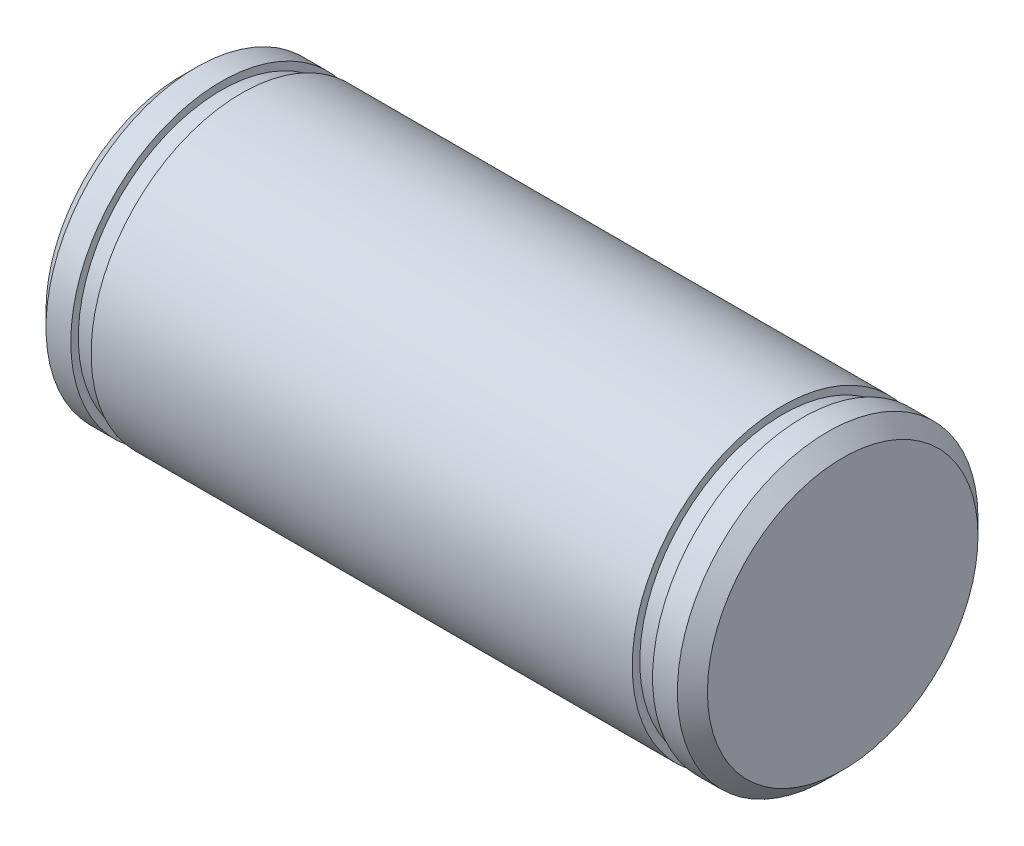
ISO-10303-21;
HEADER;
FILE_DESCRIPTION(('STEP AP214'),'2;1');
FILE_NAME('part.step','',(''),(''),'','','');
FILE_SCHEMA(('AUTOMOTIVE_DESIGN { 1 0 10303 214 1 1 1 1 }'));
ENDSEC;
DATA;
#1=APPLICATION_CONTEXT('core data for automotive mechanical design processes');
#2=APPLICATION_PROTOCOL_DEFINITION('international standard','automotive_design',2000,#1);
#3=PRODUCT_CONTEXT('',#1,'mechanical');
#4=PRODUCT('Part','Part','',(#3));
#5=PRODUCT_RELATED_PRODUCT_CATEGORY('part','',(#4));
#6=PRODUCT_DEFINITION_FORMATION('','',#4);
#7=PRODUCT_DEFINITION_CONTEXT('part definition',#1,'design');
#8=PRODUCT_DEFINITION('design','',#6,#7);
#9=PRODUCT_DEFINITION_SHAPE('','',#8);
#10=(LENGTH_UNIT() NAMED_UNIT(*) SI_UNIT(.MILLI.,.METRE.));
#11=(NAMED_UNIT(*) PLANE_ANGLE_UNIT() SI_UNIT($,.RADIAN.));
#12=(NAMED_UNIT(*) SI_UNIT($,.STERADIAN.) SOLID_ANGLE_UNIT());
#13=UNCERTAINTY_MEASURE_WITH_UNIT(LENGTH_MEASURE(1.E-05),#10,'distance_accuracy_value','');
#14=(GEOMETRIC_REPRESENTATION_CONTEXT(3) GLOBAL_UNCERTAINTY_ASSIGNED_CONTEXT((#13)) GLOBAL_UNIT_ASSIGNED_CONTEXT((#10,
#11,#12)) REPRESENTATION_CONTEXT('',''));
#15=CARTESIAN_POINT('',(0.,0.,0.));
#16=DIRECTION('',(0.,0.,1.));
#17=DIRECTION('',(1.,0.,0.));
#18=AXIS2_PLACEMENT_3D('',#15,#16,#17);
#19=CARTESIAN_POINT('',(22.,0.,0.));
#20=DIRECTION('',(1.,0.,0.));
#21=DIRECTION('',(0.,0.,-1.));
#22=AXIS2_PLACEMENT_3D('',#19,#20,#21);
#23=CYLINDRICAL_SURFACE('',#22,10.);
#24=CARTESIAN_POINT('',(19.35,0.,0.));
#25=DIRECTION('',(1.,0.,0.));
#26=DIRECTION('',(0.,0.,-1.));
#27=AXIS2_PLACEMENT_3D('',#24,#25,#26);
#28=CIRCLE('',#27,10.);
#29=CARTESIAN_POINT('',(19.35,0.,-10.));
#30=VERTEX_POINT('',#29);
#31=EDGE_CURVE('E113',#30,#30,#28,.T.);
#32=ORIENTED_EDGE('',*,*,#31,.T.);
#33=EDGE_LOOP('',(#32));
#34=FACE_BOUND('',#33,.T.);
#35=CARTESIAN_POINT('',(21.,0.,0.));
#36=DIRECTION('',(1.,0.,0.));
#37=DIRECTION('',(0.,0.,-1.));
#38=AXIS2_PLACEMENT_3D('',#35,#36,#37);
#39=CIRCLE('',#38,10.);
#40=CARTESIAN_POINT('',(21.,0.,-10.));
#41=VERTEX_POINT('',#40);
#42=EDGE_CURVE('E10',#41,#41,#39,.T.);
#43=ORIENTED_EDGE('',*,*,#42,.F.);
#44=EDGE_LOOP('',(#43));
#45=FACE_BOUND('',#44,.T.);
#46=ADVANCED_FACE('F15',(#34,#45),#23,.T.);
#47=CARTESIAN_POINT('',(21.,0.,0.));
#48=DIRECTION('',(-1.,0.,0.));
#49=DIRECTION('',(0.,0.,1.));
#50=AXIS2_PLACEMENT_3D('',#47,#48,#49);
#51=CONICAL_SURFACE('',#50,10.,0.785398163397446);
#52=ORIENTED_EDGE('',*,*,#42,.T.);
#53=EDGE_LOOP('',(#52));
#54=FACE_BOUND('',#53,.T.);
#55=CARTESIAN_POINT('',(22.,0.,0.));
#56=DIRECTION('',(1.,0.,0.));
#57=DIRECTION('',(0.,0.,-1.));
#58=AXIS2_PLACEMENT_3D('',#55,#56,#57);
#59=CIRCLE('',#58,9.);
#60=CARTESIAN_POINT('',(22.,0.,-9.));
#61=VERTEX_POINT('',#60);
#62=EDGE_CURVE('E24',#61,#61,#59,.T.);
#63=ORIENTED_EDGE('',*,*,#62,.F.);
#64=EDGE_LOOP('',(#63));
#65=FACE_BOUND('',#64,.T.);
#66=ADVANCED_FACE('F133',(#54,#65),#51,.T.);
#67=CARTESIAN_POINT('',(22.,9.,0.));
#68=DIRECTION('',(-1.,0.,0.));
#69=DIRECTION('',(0.,0.,1.));
#70=AXIS2_PLACEMENT_3D('',#67,#68,#69);
#71=PLANE('',#70);
#72=ORIENTED_EDGE('',*,*,#62,.T.);
#73=EDGE_LOOP('',(#72));
#74=FACE_BOUND('',#73,.T.);
#75=ADVANCED_FACE('F124',(#74),#71,.F.);
#76=CARTESIAN_POINT('',(72.,0.,0.));
#77=DIRECTION('',(1.,0.,0.));
#78=DIRECTION('',(0.,0.,-1.));
#79=AXIS2_PLACEMENT_3D('',#76,#77,#78);
#80=CYLINDRICAL_SURFACE('',#79,9.5);
#81=CARTESIAN_POINT('',(18.,0.,0.));
#82=DIRECTION('',(1.,0.,0.));
#83=DIRECTION('',(0.,0.,-1.));
#84=AXIS2_PLACEMENT_3D('',#81,#82,#83);
#85=CIRCLE('',#84,9.5);
#86=CARTESIAN_POINT('',(18.,0.,-9.5));
#87=VERTEX_POINT('',#86);
#88=EDGE_CURVE('E95',#87,#87,#85,.T.);
#89=ORIENTED_EDGE('',*,*,#88,.T.);
#90=EDGE_LOOP('',(#89));
#91=FACE_BOUND('',#90,.T.);
#92=CARTESIAN_POINT('',(19.35,0.,0.));
#93=DIRECTION('',(1.,0.,0.));
#94=DIRECTION('',(0.,0.,-1.));
#95=AXIS2_PLACEMENT_3D('',#92,#93,#94);
#96=CIRCLE('',#95,9.5);
#97=CARTESIAN_POINT('',(19.35,0.,-9.5));
#98=VERTEX_POINT('',#97);
#99=EDGE_CURVE('E112',#98,#98,#96,.T.);
#100=ORIENTED_EDGE('',*,*,#99,.F.);
#101=EDGE_LOOP('',(#100));
#102=FACE_BOUND('',#101,.T.);
#103=ADVANCED_FACE('F17',(#91,#102),#80,.T.);
#104=CARTESIAN_POINT('',(19.35,9.5,0.));
#105=DIRECTION('',(1.,0.,0.));
#106=DIRECTION('',(0.,1.,0.));
#107=AXIS2_PLACEMENT_3D('',#104,#105,#106);
#108=PLANE('',#107);
#109=ORIENTED_EDGE('',*,*,#99,.T.);
#110=EDGE_LOOP('',(#109));
#111=FACE_BOUND('',#110,.T.);
#112=ORIENTED_EDGE('',*,*,#31,.F.);
#113=EDGE_LOOP('',(#112));
#114=FACE_BOUND('',#113,.T.);
#115=ADVANCED_FACE('F120',(#111,#114),#108,.F.);
#116=CARTESIAN_POINT('',(18.,29.5,0.));
#117=DIRECTION('',(-1.,0.,0.));
#118=DIRECTION('',(0.,0.,1.));
#119=AXIS2_PLACEMENT_3D('',#116,#117,#118);
#120=PLANE('',#119);
#121=CARTESIAN_POINT('',(18.,0.,0.));
#122=DIRECTION('',(-1.,0.,0.));
#123=DIRECTION('',(0.,0.,1.));
#124=AXIS2_PLACEMENT_3D('',#121,#122,#123);
#125=CIRCLE('',#124,10.);
#126=CARTESIAN_POINT('',(18.,0.,10.));
#127=VERTEX_POINT('',#126);
#128=EDGE_CURVE('E81',#127,#127,#125,.T.);
#129=ORIENTED_EDGE('',*,*,#128,.F.);
#130=EDGE_LOOP('',(#129));
#131=FACE_BOUND('',#130,.T.);
#132=ORIENTED_EDGE('',*,*,#88,.F.);
#133=EDGE_LOOP('',(#132));
#134=FACE_BOUND('',#133,.T.);
#135=ADVANCED_FACE('F131',(#131,#134),#120,.F.);
#136=CARTESIAN_POINT('',(72.,0.,0.));
#137=DIRECTION('',(1.,0.,0.));
#138=DIRECTION('',(0.,0.,-1.));
#139=AXIS2_PLACEMENT_3D('',#136,#137,#138);
#140=CYLINDRICAL_SURFACE('',#139,9.5);
#141=CARTESIAN_POINT('',(-19.35,0.,0.));
#142=DIRECTION('',(1.,0.,0.));
#143=DIRECTION('',(0.,0.,-1.));
#144=AXIS2_PLACEMENT_3D('',#141,#142,#143);
#145=CIRCLE('',#144,9.5);
#146=CARTESIAN_POINT('',(-19.35,0.,-9.5));
#147=VERTEX_POINT('',#146);
#148=EDGE_CURVE('E98',#147,#147,#145,.T.);
#149=ORIENTED_EDGE('',*,*,#148,.T.);
#150=EDGE_LOOP('',(#149));
#151=FACE_BOUND('',#150,.T.);
#152=CARTESIAN_POINT('',(-18.,0.,0.));
#153=DIRECTION('',(1.,0.,0.));
#154=DIRECTION('',(0.,0.,-1.));
#155=AXIS2_PLACEMENT_3D('',#152,#153,#154);
#156=CIRCLE('',#155,9.5);
#157=CARTESIAN_POINT('',(-18.,0.,-9.5));
#158=VERTEX_POINT('',#157);
#159=EDGE_CURVE('E103',#158,#158,#156,.T.);
#160=ORIENTED_EDGE('',*,*,#159,.F.);
#161=EDGE_LOOP('',(#160));
#162=FACE_BOUND('',#161,.T.);
#163=ADVANCED_FACE('F145',(#151,#162),#140,.T.);
#164=CARTESIAN_POINT('',(-18.,9.5,0.));
#165=DIRECTION('',(1.,0.,0.));
#166=DIRECTION('',(0.,1.,0.));
#167=AXIS2_PLACEMENT_3D('',#164,#165,#166);
#168=PLANE('',#167);
#169=ORIENTED_EDGE('',*,*,#159,.T.);
#170=EDGE_LOOP('',(#169));
#171=FACE_BOUND('',#170,.T.);
#172=CARTESIAN_POINT('',(-18.,0.,0.));
#173=DIRECTION('',(1.,0.,0.));
#174=DIRECTION('',(0.,0.,-1.));
#175=AXIS2_PLACEMENT_3D('',#172,#173,#174);
#176=CIRCLE('',#175,10.);
#177=CARTESIAN_POINT('',(-18.,0.,-10.));
#178=VERTEX_POINT('',#177);
#179=EDGE_CURVE('E85',#178,#178,#176,.T.);
#180=ORIENTED_EDGE('',*,*,#179,.F.);
#181=EDGE_LOOP('',(#180));
#182=FACE_BOUND('',#181,.T.);
#183=ADVANCED_FACE('F148',(#171,#182),#168,.F.);
#184=CARTESIAN_POINT('',(-19.35,29.5,0.));
#185=DIRECTION('',(-1.,0.,0.));
#186=DIRECTION('',(0.,0.,1.));
#187=AXIS2_PLACEMENT_3D('',#184,#185,#186);
#188=PLANE('',#187);
#189=CARTESIAN_POINT('',(-19.35,0.,0.));
#190=DIRECTION('',(-1.,0.,0.));
#191=DIRECTION('',(0.,0.,1.));
#192=AXIS2_PLACEMENT_3D('',#189,#190,#191);
#193=CIRCLE('',#192,10.);
#194=CARTESIAN_POINT('',(-19.35,0.,10.));
#195=VERTEX_POINT('',#194);
#196=EDGE_CURVE('E91',#195,#195,#193,.T.);
#197=ORIENTED_EDGE('',*,*,#196,.F.);
#198=EDGE_LOOP('',(#197));
#199=FACE_BOUND('',#198,.T.);
#200=ORIENTED_EDGE('',*,*,#148,.F.);
#201=EDGE_LOOP('',(#200));
#202=FACE_BOUND('',#201,.T.);
#203=ADVANCED_FACE('F151',(#199,#202),#188,.F.);
#204=CARTESIAN_POINT('',(-22.,0.,0.));
#205=DIRECTION('',(1.,0.,0.));
#206=DIRECTION('',(0.,0.,-1.));
#207=AXIS2_PLACEMENT_3D('',#204,#205,#206);
#208=CONICAL_SURFACE('',#207,9.,0.785398163397447);
#209=CARTESIAN_POINT('',(-22.,0.,0.));
#210=DIRECTION('',(1.,0.,0.));
#211=DIRECTION('',(0.,0.,-1.));
#212=AXIS2_PLACEMENT_3D('',#209,#210,#211);
#213=CIRCLE('',#212,9.);
#214=CARTESIAN_POINT('',(-22.,0.,-9.));
#215=VERTEX_POINT('',#214);
#216=EDGE_CURVE('E96',#215,#215,#213,.T.);
#217=ORIENTED_EDGE('',*,*,#216,.T.);
#218=EDGE_LOOP('',(#217));
#219=FACE_BOUND('',#218,.T.);
#220=CARTESIAN_POINT('',(-21.,0.,0.));
#221=DIRECTION('',(1.,0.,0.));
#222=DIRECTION('',(0.,0.,-1.));
#223=AXIS2_PLACEMENT_3D('',#220,#221,#222);
#224=CIRCLE('',#223,10.);
#225=CARTESIAN_POINT('',(-21.,0.,-10.));
#226=VERTEX_POINT('',#225);
#227=EDGE_CURVE('E99',#226,#226,#224,.T.);
#228=ORIENTED_EDGE('',*,*,#227,.F.);
#229=EDGE_LOOP('',(#228));
#230=FACE_BOUND('',#229,.T.);
#231=ADVANCED_FACE('F154',(#219,#230),#208,.T.);
#232=CARTESIAN_POINT('',(-22.,0.,0.));
#233=DIRECTION('',(1.,0.,0.));
#234=DIRECTION('',(0.,1.,0.));
#235=AXIS2_PLACEMENT_3D('',#232,#233,#234);
#236=PLANE('',#235);
#237=ORIENTED_EDGE('',*,*,#216,.F.);
#238=EDGE_LOOP('',(#237));
#239=FACE_BOUND('',#238,.T.);
#240=ADVANCED_FACE('F157',(#239),#236,.F.);
#241=CARTESIAN_POINT('',(22.,0.,0.));
#242=DIRECTION('',(1.,0.,0.));
#243=DIRECTION('',(0.,0.,-1.));
#244=AXIS2_PLACEMENT_3D('',#241,#242,#243);
#245=CYLINDRICAL_SURFACE('',#244,10.);
#246=ORIENTED_EDGE('',*,*,#227,.T.);
#247=EDGE_LOOP('',(#246));
#248=FACE_BOUND('',#247,.T.);
#249=ORIENTED_EDGE('',*,*,#196,.T.);
#250=EDGE_LOOP('',(#249));
#251=FACE_BOUND('',#250,.T.);
#252=ADVANCED_FACE('F161',(#248,#251),#245,.T.);
#253=CARTESIAN_POINT('',(22.,0.,0.));
#254=DIRECTION('',(1.,0.,0.));
#255=DIRECTION('',(0.,0.,-1.));
#256=AXIS2_PLACEMENT_3D('',#253,#254,#255);
#257=CYLINDRICAL_SURFACE('',#256,10.);
#258=ORIENTED_EDGE('',*,*,#179,.T.);
#259=EDGE_LOOP('',(#258));
#260=FACE_BOUND('',#259,.T.);
#261=ORIENTED_EDGE('',*,*,#128,.T.);
#262=EDGE_LOOP('',(#261));
#263=FACE_BOUND('',#262,.T.);
#264=ADVANCED_FACE('F82',(#260,#263),#257,.T.);
#265=CLOSED_SHELL('',(#46,#66,#75,#103,#115,#135,#163,#183,#203,#231,#240,#252,#264));
#266=MANIFOLD_SOLID_BREP('B1',#265);
#267=ADVANCED_BREP_SHAPE_REPRESENTATION('',(#18,#266),#14);
#268=SHAPE_DEFINITION_REPRESENTATION(#9,#267);
ENDSEC;
END-ISO-10303-21;
